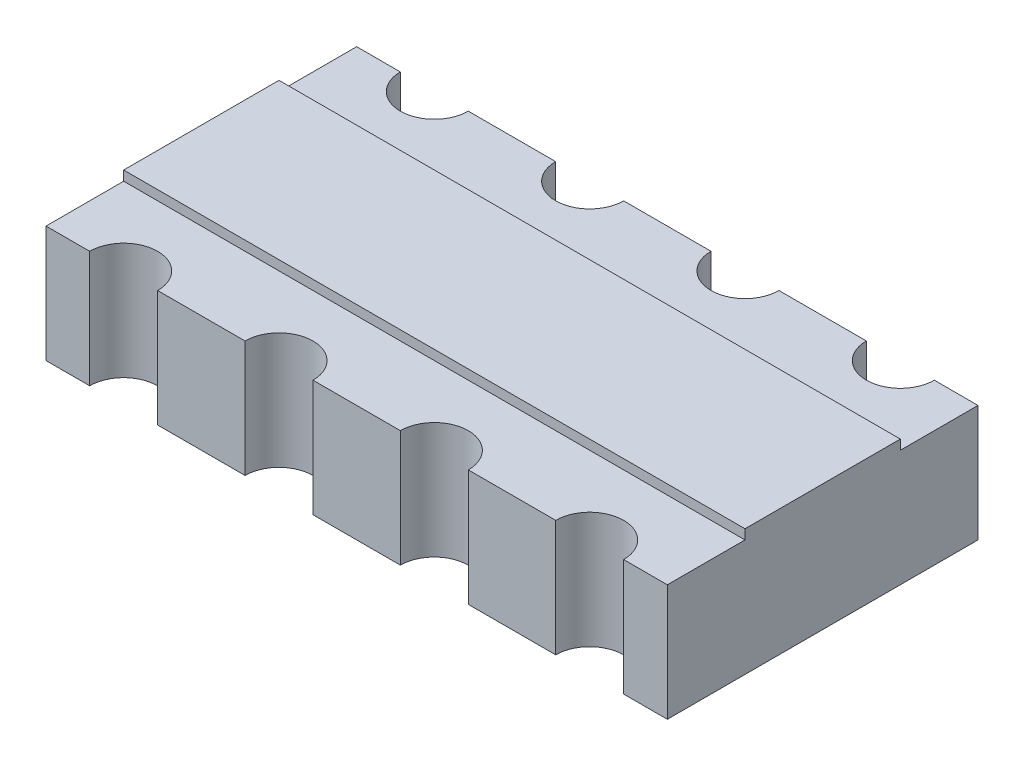
ISO-10303-21;
HEADER;
FILE_DESCRIPTION(('STEP AP214'),'2;1');
FILE_NAME('part.step','',(''),(''),'','','');
FILE_SCHEMA(('AUTOMOTIVE_DESIGN { 1 0 10303 214 1 1 1 1 }'));
ENDSEC;
DATA;
#1=APPLICATION_CONTEXT('core data for automotive mechanical design processes');
#2=APPLICATION_PROTOCOL_DEFINITION('international standard','automotive_design',2000,#1);
#3=PRODUCT_CONTEXT('',#1,'mechanical');
#4=PRODUCT('Part','Part','',(#3));
#5=PRODUCT_RELATED_PRODUCT_CATEGORY('part','',(#4));
#6=PRODUCT_DEFINITION_FORMATION('','',#4);
#7=PRODUCT_DEFINITION_CONTEXT('part definition',#1,'design');
#8=PRODUCT_DEFINITION('design','',#6,#7);
#9=PRODUCT_DEFINITION_SHAPE('','',#8);
#10=(LENGTH_UNIT() NAMED_UNIT(*) SI_UNIT(.MILLI.,.METRE.));
#11=(NAMED_UNIT(*) PLANE_ANGLE_UNIT() SI_UNIT($,.RADIAN.));
#12=(NAMED_UNIT(*) SI_UNIT($,.STERADIAN.) SOLID_ANGLE_UNIT());
#13=UNCERTAINTY_MEASURE_WITH_UNIT(LENGTH_MEASURE(1.E-05),#10,'distance_accuracy_value','');
#14=(GEOMETRIC_REPRESENTATION_CONTEXT(3) GLOBAL_UNCERTAINTY_ASSIGNED_CONTEXT((#13)) GLOBAL_UNIT_ASSIGNED_CONTEXT((#10,
#11,#12)) REPRESENTATION_CONTEXT('',''));
#15=CARTESIAN_POINT('',(0.,0.,0.));
#16=DIRECTION('',(0.,0.,1.));
#17=DIRECTION('',(1.,0.,0.));
#18=AXIS2_PLACEMENT_3D('',#15,#16,#17);
#19=CARTESIAN_POINT('',(0.,0.65,0.));
#20=DIRECTION('',(0.,-1.,0.));
#21=DIRECTION('',(0.,0.,-1.));
#22=AXIS2_PLACEMENT_3D('',#19,#20,#21);
#23=PLANE('',#22);
#24=DIRECTION('',(0.,0.,-1.));
#25=VECTOR('',#24,1.);
#26=CARTESIAN_POINT('',(1.6,0.65,0.4));
#27=LINE('',#26,#25);
#28=CARTESIAN_POINT('',(1.6,0.65,0.4));
#29=VERTEX_POINT('',#28);
#30=CARTESIAN_POINT('',(1.6,0.65,-0.4));
#31=VERTEX_POINT('',#30);
#32=EDGE_CURVE('E264',#29,#31,#27,.T.);
#33=ORIENTED_EDGE('',*,*,#32,.T.);
#34=DIRECTION('',(-1.,0.,0.));
#35=VECTOR('',#34,1.);
#36=CARTESIAN_POINT('',(-1.6,0.65,-0.4));
#37=LINE('',#36,#35);
#38=CARTESIAN_POINT('',(-1.6,0.65,-0.4));
#39=VERTEX_POINT('',#38);
#40=EDGE_CURVE('E29',#31,#39,#37,.T.);
#41=ORIENTED_EDGE('',*,*,#40,.T.);
#42=DIRECTION('',(0.,0.,1.));
#43=VECTOR('',#42,1.);
#44=CARTESIAN_POINT('',(-1.6,0.65,0.4));
#45=LINE('',#44,#43);
#46=CARTESIAN_POINT('',(-1.6,0.65,0.4));
#47=VERTEX_POINT('',#46);
#48=EDGE_CURVE('E239',#39,#47,#45,.T.);
#49=ORIENTED_EDGE('',*,*,#48,.T.);
#50=DIRECTION('',(1.,0.,0.));
#51=VECTOR('',#50,1.);
#52=CARTESIAN_POINT('',(-1.6,0.65,0.4));
#53=LINE('',#52,#51);
#54=EDGE_CURVE('E11',#47,#29,#53,.T.);
#55=ORIENTED_EDGE('',*,*,#54,.T.);
#56=EDGE_LOOP('',(#33,#41,#49,#55));
#57=FACE_BOUND('',#56,.T.);
#58=ADVANCED_FACE('F18',(#57),#23,.F.);
#59=CARTESIAN_POINT('',(-1.6,0.65,0.4));
#60=DIRECTION('',(0.,0.,-1.));
#61=DIRECTION('',(0.,-1.,0.));
#62=AXIS2_PLACEMENT_3D('',#59,#60,#61);
#63=PLANE('',#62);
#64=DIRECTION('',(1.,0.,0.));
#65=VECTOR('',#64,1.);
#66=CARTESIAN_POINT('',(-1.6,0.6,0.4));
#67=LINE('',#66,#65);
#68=CARTESIAN_POINT('',(-1.6,0.6,0.4));
#69=VERTEX_POINT('',#68);
#70=CARTESIAN_POINT('',(1.6,0.6,0.4));
#71=VERTEX_POINT('',#70);
#72=EDGE_CURVE('E213',#69,#71,#67,.T.);
#73=ORIENTED_EDGE('',*,*,#72,.T.);
#74=DIRECTION('',(0.,-1.,0.));
#75=VECTOR('',#74,1.);
#76=CARTESIAN_POINT('',(1.6,0.65,0.4));
#77=LINE('',#76,#75);
#78=EDGE_CURVE('E266',#29,#71,#77,.T.);
#79=ORIENTED_EDGE('',*,*,#78,.F.);
#80=ORIENTED_EDGE('',*,*,#54,.F.);
#81=DIRECTION('',(0.,-1.,0.));
#82=VECTOR('',#81,1.);
#83=CARTESIAN_POINT('',(-1.6,0.65,0.4));
#84=LINE('',#83,#82);
#85=EDGE_CURVE('E323',#47,#69,#84,.T.);
#86=ORIENTED_EDGE('',*,*,#85,.T.);
#87=EDGE_LOOP('',(#73,#79,#80,#86));
#88=FACE_BOUND('',#87,.T.);
#89=ADVANCED_FACE('F957',(#88),#63,.F.);
#90=CARTESIAN_POINT('',(-1.6,0.65,-0.4));
#91=DIRECTION('',(0.,0.,1.));
#92=DIRECTION('',(1.,0.,0.));
#93=AXIS2_PLACEMENT_3D('',#90,#91,#92);
#94=PLANE('',#93);
#95=DIRECTION('',(-1.,0.,0.));
#96=VECTOR('',#95,1.);
#97=CARTESIAN_POINT('',(-1.6,0.6,-0.4));
#98=LINE('',#97,#96);
#99=CARTESIAN_POINT('',(1.6,0.6,-0.4));
#100=VERTEX_POINT('',#99);
#101=CARTESIAN_POINT('',(-1.6,0.6,-0.4));
#102=VERTEX_POINT('',#101);
#103=EDGE_CURVE('E364',#100,#102,#98,.T.);
#104=ORIENTED_EDGE('',*,*,#103,.T.);
#105=DIRECTION('',(0.,-1.,0.));
#106=VECTOR('',#105,1.);
#107=CARTESIAN_POINT('',(-1.6,0.65,-0.4));
#108=LINE('',#107,#106);
#109=EDGE_CURVE('E234',#39,#102,#108,.T.);
#110=ORIENTED_EDGE('',*,*,#109,.F.);
#111=ORIENTED_EDGE('',*,*,#40,.F.);
#112=DIRECTION('',(0.,-1.,0.));
#113=VECTOR('',#112,1.);
#114=CARTESIAN_POINT('',(1.6,0.65,-0.4));
#115=LINE('',#114,#113);
#116=EDGE_CURVE('E261',#31,#100,#115,.T.);
#117=ORIENTED_EDGE('',*,*,#116,.T.);
#118=EDGE_LOOP('',(#104,#110,#111,#117));
#119=FACE_BOUND('',#118,.T.);
#120=ADVANCED_FACE('F948',(#119),#94,.F.);
#121=CARTESIAN_POINT('',(1.2,0.6,-0.8));
#122=DIRECTION('',(0.,-1.,0.));
#123=DIRECTION('',(0.,0.,-1.));
#124=AXIS2_PLACEMENT_3D('',#121,#122,#123);
#125=CYLINDRICAL_SURFACE('',#124,0.175);
#126=CARTESIAN_POINT('',(1.2,0.,-0.8));
#127=DIRECTION('',(0.,1.,0.));
#128=DIRECTION('',(0.,0.,1.));
#129=AXIS2_PLACEMENT_3D('',#126,#127,#128);
#130=CIRCLE('',#129,0.175);
#131=CARTESIAN_POINT('',(1.025,0.,-0.8));
#132=VERTEX_POINT('',#131);
#133=CARTESIAN_POINT('',(1.375,0.,-0.8));
#134=VERTEX_POINT('',#133);
#135=EDGE_CURVE('E403',#132,#134,#130,.T.);
#136=ORIENTED_EDGE('',*,*,#135,.F.);
#137=DIRECTION('',(0.,-1.,0.));
#138=VECTOR('',#137,1.);
#139=CARTESIAN_POINT('',(1.025,0.6,-0.8));
#140=LINE('',#139,#138);
#141=CARTESIAN_POINT('',(1.025,0.6,-0.8));
#142=VERTEX_POINT('',#141);
#143=EDGE_CURVE('E281',#142,#132,#140,.T.);
#144=ORIENTED_EDGE('',*,*,#143,.F.);
#145=CARTESIAN_POINT('',(1.2,0.6,-0.8));
#146=DIRECTION('',(0.,1.,0.));
#147=DIRECTION('',(0.,0.,1.));
#148=AXIS2_PLACEMENT_3D('',#145,#146,#147);
#149=CIRCLE('',#148,0.175);
#150=CARTESIAN_POINT('',(1.375,0.6,-0.8));
#151=VERTEX_POINT('',#150);
#152=EDGE_CURVE('E375',#142,#151,#149,.T.);
#153=ORIENTED_EDGE('',*,*,#152,.T.);
#154=DIRECTION('',(0.,-1.,0.));
#155=VECTOR('',#154,1.);
#156=CARTESIAN_POINT('',(1.375,0.6,-0.8));
#157=LINE('',#156,#155);
#158=EDGE_CURVE('E233',#151,#134,#157,.T.);
#159=ORIENTED_EDGE('',*,*,#158,.T.);
#160=EDGE_LOOP('',(#136,#144,#153,#159));
#161=FACE_BOUND('',#160,.T.);
#162=ADVANCED_FACE('F585',(#161),#125,.F.);
#163=CARTESIAN_POINT('',(0.8,0.6,-0.8));
#164=DIRECTION('',(0.,0.,-1.));
#165=DIRECTION('',(0.,-1.,0.));
#166=AXIS2_PLACEMENT_3D('',#163,#164,#165);
#167=PLANE('',#166);
#168=DIRECTION('',(1.,0.,0.));
#169=VECTOR('',#168,1.);
#170=CARTESIAN_POINT('',(0.8,0.,-0.8));
#171=LINE('',#170,#169);
#172=CARTESIAN_POINT('',(1.6,0.,-0.8));
#173=VERTEX_POINT('',#172);
#174=EDGE_CURVE('E407',#134,#173,#171,.T.);
#175=ORIENTED_EDGE('',*,*,#174,.F.);
#176=ORIENTED_EDGE('',*,*,#158,.F.);
#177=DIRECTION('',(1.,0.,0.));
#178=VECTOR('',#177,1.);
#179=CARTESIAN_POINT('',(0.8,0.6,-0.8));
#180=LINE('',#179,#178);
#181=CARTESIAN_POINT('',(1.6,0.6,-0.8));
#182=VERTEX_POINT('',#181);
#183=EDGE_CURVE('E363',#151,#182,#180,.T.);
#184=ORIENTED_EDGE('',*,*,#183,.T.);
#185=DIRECTION('',(0.,-1.,0.));
#186=VECTOR('',#185,1.);
#187=CARTESIAN_POINT('',(1.6,0.6,-0.8));
#188=LINE('',#187,#186);
#189=EDGE_CURVE('E265',#182,#173,#188,.T.);
#190=ORIENTED_EDGE('',*,*,#189,.T.);
#191=EDGE_LOOP('',(#175,#176,#184,#190));
#192=FACE_BOUND('',#191,.T.);
#193=ADVANCED_FACE('F589',(#192),#167,.T.);
#194=CARTESIAN_POINT('',(1.6,0.6,0.));
#195=DIRECTION('',(1.,0.,0.));
#196=DIRECTION('',(0.,0.,-1.));
#197=AXIS2_PLACEMENT_3D('',#194,#195,#196);
#198=PLANE('',#197);
#199=DIRECTION('',(0.,0.,1.));
#200=VECTOR('',#199,1.);
#201=CARTESIAN_POINT('',(1.6,0.,0.));
#202=LINE('',#201,#200);
#203=CARTESIAN_POINT('',(1.6,0.,0.8));
#204=VERTEX_POINT('',#203);
#205=EDGE_CURVE('E217',#173,#204,#202,.T.);
#206=ORIENTED_EDGE('',*,*,#205,.F.);
#207=ORIENTED_EDGE('',*,*,#189,.F.);
#208=DIRECTION('',(0.,0.,1.));
#209=VECTOR('',#208,1.);
#210=CARTESIAN_POINT('',(1.6,0.6,0.));
#211=LINE('',#210,#209);
#212=EDGE_CURVE('E360',#182,#100,#211,.T.);
#213=ORIENTED_EDGE('',*,*,#212,.T.);
#214=ORIENTED_EDGE('',*,*,#116,.F.);
#215=ORIENTED_EDGE('',*,*,#32,.F.);
#216=ORIENTED_EDGE('',*,*,#78,.T.);
#217=DIRECTION('',(0.,0.,1.));
#218=VECTOR('',#217,1.);
#219=CARTESIAN_POINT('',(1.6,0.6,0.));
#220=LINE('',#219,#218);
#221=CARTESIAN_POINT('',(1.6,0.6,0.8));
#222=VERTEX_POINT('',#221);
#223=EDGE_CURVE('E389',#71,#222,#220,.T.);
#224=ORIENTED_EDGE('',*,*,#223,.T.);
#225=DIRECTION('',(0.,-1.,0.));
#226=VECTOR('',#225,1.);
#227=CARTESIAN_POINT('',(1.6,0.6,0.8));
#228=LINE('',#227,#226);
#229=EDGE_CURVE('E308',#222,#204,#228,.T.);
#230=ORIENTED_EDGE('',*,*,#229,.T.);
#231=EDGE_LOOP('',(#206,#207,#213,#214,#215,#216,#224,#230));
#232=FACE_BOUND('',#231,.T.);
#233=ADVANCED_FACE('F923',(#232),#198,.T.);
#234=CARTESIAN_POINT('',(0.8,0.6,0.8));
#235=DIRECTION('',(0.,0.,-1.));
#236=DIRECTION('',(0.,-1.,0.));
#237=AXIS2_PLACEMENT_3D('',#234,#235,#236);
#238=PLANE('',#237);
#239=DIRECTION('',(1.,0.,0.));
#240=VECTOR('',#239,1.);
#241=CARTESIAN_POINT('',(0.8,0.,0.8));
#242=LINE('',#241,#240);
#243=CARTESIAN_POINT('',(1.375,0.,0.8));
#244=VERTEX_POINT('',#243);
#245=EDGE_CURVE('E246',#244,#204,#242,.T.);
#246=ORIENTED_EDGE('',*,*,#245,.T.);
#247=ORIENTED_EDGE('',*,*,#229,.F.);
#248=DIRECTION('',(1.,0.,0.));
#249=VECTOR('',#248,1.);
#250=CARTESIAN_POINT('',(0.8,0.6,0.8));
#251=LINE('',#250,#249);
#252=CARTESIAN_POINT('',(1.375,0.6,0.8));
#253=VERTEX_POINT('',#252);
#254=EDGE_CURVE('E244',#253,#222,#251,.T.);
#255=ORIENTED_EDGE('',*,*,#254,.F.);
#256=DIRECTION('',(0.,-1.,0.));
#257=VECTOR('',#256,1.);
#258=CARTESIAN_POINT('',(1.375,0.6,0.8));
#259=LINE('',#258,#257);
#260=EDGE_CURVE('E305',#253,#244,#259,.T.);
#261=ORIENTED_EDGE('',*,*,#260,.T.);
#262=EDGE_LOOP('',(#246,#247,#255,#261));
#263=FACE_BOUND('',#262,.T.);
#264=ADVANCED_FACE('F519',(#263),#238,.F.);
#265=CARTESIAN_POINT('',(1.2,0.6,0.8));
#266=DIRECTION('',(0.,-1.,0.));
#267=DIRECTION('',(0.,0.,-1.));
#268=AXIS2_PLACEMENT_3D('',#265,#266,#267);
#269=CYLINDRICAL_SURFACE('',#268,0.175);
#270=CARTESIAN_POINT('',(1.2,0.,0.8));
#271=DIRECTION('',(0.,-1.,0.));
#272=DIRECTION('',(0.,0.,1.));
#273=AXIS2_PLACEMENT_3D('',#270,#271,#272);
#274=CIRCLE('',#273,0.175);
#275=CARTESIAN_POINT('',(1.025,0.,0.8));
#276=VERTEX_POINT('',#275);
#277=EDGE_CURVE('E250',#276,#244,#274,.T.);
#278=ORIENTED_EDGE('',*,*,#277,.T.);
#279=ORIENTED_EDGE('',*,*,#260,.F.);
#280=CARTESIAN_POINT('',(1.2,0.6,0.8));
#281=DIRECTION('',(0.,-1.,0.));
#282=DIRECTION('',(0.,0.,1.));
#283=AXIS2_PLACEMENT_3D('',#280,#281,#282);
#284=CIRCLE('',#283,0.175);
#285=CARTESIAN_POINT('',(1.025,0.6,0.8));
#286=VERTEX_POINT('',#285);
#287=EDGE_CURVE('E240',#286,#253,#284,.T.);
#288=ORIENTED_EDGE('',*,*,#287,.F.);
#289=DIRECTION('',(0.,-1.,0.));
#290=VECTOR('',#289,1.);
#291=CARTESIAN_POINT('',(1.025,0.6,0.8));
#292=LINE('',#291,#290);
#293=EDGE_CURVE('E309',#286,#276,#292,.T.);
#294=ORIENTED_EDGE('',*,*,#293,.T.);
#295=EDGE_LOOP('',(#278,#279,#288,#294));
#296=FACE_BOUND('',#295,.T.);
#297=ADVANCED_FACE('F515',(#296),#269,.F.);
#298=CARTESIAN_POINT('',(0.8,0.6,0.8));
#299=DIRECTION('',(0.,0.,-1.));
#300=DIRECTION('',(0.,-1.,0.));
#301=AXIS2_PLACEMENT_3D('',#298,#299,#300);
#302=PLANE('',#301);
#303=DIRECTION('',(1.,0.,0.));
#304=VECTOR('',#303,1.);
#305=CARTESIAN_POINT('',(0.8,0.,0.8));
#306=LINE('',#305,#304);
#307=CARTESIAN_POINT('',(0.575,0.,0.8));
#308=VERTEX_POINT('',#307);
#309=EDGE_CURVE('E260',#308,#276,#306,.T.);
#310=ORIENTED_EDGE('',*,*,#309,.T.);
#311=ORIENTED_EDGE('',*,*,#293,.F.);
#312=DIRECTION('',(1.,0.,0.));
#313=VECTOR('',#312,1.);
#314=CARTESIAN_POINT('',(0.8,0.6,0.8));
#315=LINE('',#314,#313);
#316=CARTESIAN_POINT('',(0.575,0.6,0.8));
#317=VERTEX_POINT('',#316);
#318=EDGE_CURVE('E245',#317,#286,#315,.T.);
#319=ORIENTED_EDGE('',*,*,#318,.F.);
#320=DIRECTION('',(0.,-1.,0.));
#321=VECTOR('',#320,1.);
#322=CARTESIAN_POINT('',(0.575,0.6,0.8));
#323=LINE('',#322,#321);
#324=EDGE_CURVE('E22',#317,#308,#323,.T.);
#325=ORIENTED_EDGE('',*,*,#324,.T.);
#326=EDGE_LOOP('',(#310,#311,#319,#325));
#327=FACE_BOUND('',#326,.T.);
#328=ADVANCED_FACE('F509',(#327),#302,.F.);
#329=CARTESIAN_POINT('',(0.4,0.6,0.8));
#330=DIRECTION('',(0.,-1.,0.));
#331=DIRECTION('',(0.,0.,-1.));
#332=AXIS2_PLACEMENT_3D('',#329,#330,#331);
#333=CYLINDRICAL_SURFACE('',#332,0.175);
#334=CARTESIAN_POINT('',(0.4,0.,0.8));
#335=DIRECTION('',(0.,1.,0.));
#336=DIRECTION('',(0.,0.,1.));
#337=AXIS2_PLACEMENT_3D('',#334,#335,#336);
#338=CIRCLE('',#337,0.175);
#339=CARTESIAN_POINT('',(0.225,0.,0.8));
#340=VERTEX_POINT('',#339);
#341=EDGE_CURVE('E338',#308,#340,#338,.T.);
#342=ORIENTED_EDGE('',*,*,#341,.F.);
#343=ORIENTED_EDGE('',*,*,#324,.F.);
#344=CARTESIAN_POINT('',(0.4,0.6,0.8));
#345=DIRECTION('',(0.,1.,0.));
#346=DIRECTION('',(0.,0.,1.));
#347=AXIS2_PLACEMENT_3D('',#344,#345,#346);
#348=CIRCLE('',#347,0.175);
#349=CARTESIAN_POINT('',(0.225,0.6,0.8));
#350=VERTEX_POINT('',#349);
#351=EDGE_CURVE('E327',#317,#350,#348,.T.);
#352=ORIENTED_EDGE('',*,*,#351,.T.);
#353=DIRECTION('',(0.,-1.,0.));
#354=VECTOR('',#353,1.);
#355=CARTESIAN_POINT('',(0.225,0.6,0.8));
#356=LINE('',#355,#354);
#357=EDGE_CURVE('E313',#350,#340,#356,.T.);
#358=ORIENTED_EDGE('',*,*,#357,.T.);
#359=EDGE_LOOP('',(#342,#343,#352,#358));
#360=FACE_BOUND('',#359,.T.);
#361=ADVANCED_FACE('F504',(#360),#333,.F.);
#362=CARTESIAN_POINT('',(0.4,0.6,-0.8));
#363=DIRECTION('',(0.,-1.,0.));
#364=DIRECTION('',(0.,0.,-1.));
#365=AXIS2_PLACEMENT_3D('',#362,#363,#364);
#366=CYLINDRICAL_SURFACE('',#365,0.175);
#367=CARTESIAN_POINT('',(0.4,0.,-0.8));
#368=DIRECTION('',(0.,-1.,0.));
#369=DIRECTION('',(0.,0.,1.));
#370=AXIS2_PLACEMENT_3D('',#367,#368,#369);
#371=CIRCLE('',#370,0.175);
#372=CARTESIAN_POINT('',(0.575,0.,-0.8));
#373=VERTEX_POINT('',#372);
#374=CARTESIAN_POINT('',(0.225,0.,-0.8));
#375=VERTEX_POINT('',#374);
#376=EDGE_CURVE('E255',#373,#375,#371,.T.);
#377=ORIENTED_EDGE('',*,*,#376,.T.);
#378=DIRECTION('',(0.,-1.,0.));
#379=VECTOR('',#378,1.);
#380=CARTESIAN_POINT('',(0.225,0.6,-0.8));
#381=LINE('',#380,#379);
#382=CARTESIAN_POINT('',(0.225,0.6,-0.8));
#383=VERTEX_POINT('',#382);
#384=EDGE_CURVE('E219',#383,#375,#381,.T.);
#385=ORIENTED_EDGE('',*,*,#384,.F.);
#386=CARTESIAN_POINT('',(0.4,0.6,-0.8));
#387=DIRECTION('',(0.,-1.,0.));
#388=DIRECTION('',(0.,0.,1.));
#389=AXIS2_PLACEMENT_3D('',#386,#387,#388);
#390=CIRCLE('',#389,0.175);
#391=CARTESIAN_POINT('',(0.575,0.6,-0.8));
#392=VERTEX_POINT('',#391);
#393=EDGE_CURVE('E251',#392,#383,#390,.T.);
#394=ORIENTED_EDGE('',*,*,#393,.F.);
#395=DIRECTION('',(0.,-1.,0.));
#396=VECTOR('',#395,1.);
#397=CARTESIAN_POINT('',(0.575,0.6,-0.8));
#398=LINE('',#397,#396);
#399=EDGE_CURVE('E285',#392,#373,#398,.T.);
#400=ORIENTED_EDGE('',*,*,#399,.T.);
#401=EDGE_LOOP('',(#377,#385,#394,#400));
#402=FACE_BOUND('',#401,.T.);
#403=ADVANCED_FACE('F570',(#402),#366,.F.);
#404=CARTESIAN_POINT('',(0.8,0.6,-0.8));
#405=DIRECTION('',(0.,0.,-1.));
#406=DIRECTION('',(0.,-1.,0.));
#407=AXIS2_PLACEMENT_3D('',#404,#405,#406);
#408=PLANE('',#407);
#409=DIRECTION('',(1.,0.,0.));
#410=VECTOR('',#409,1.);
#411=CARTESIAN_POINT('',(0.8,0.,-0.8));
#412=LINE('',#411,#410);
#413=EDGE_CURVE('E358',#373,#132,#412,.T.);
#414=ORIENTED_EDGE('',*,*,#413,.F.);
#415=ORIENTED_EDGE('',*,*,#399,.F.);
#416=DIRECTION('',(1.,0.,0.));
#417=VECTOR('',#416,1.);
#418=CARTESIAN_POINT('',(0.8,0.6,-0.8));
#419=LINE('',#418,#417);
#420=EDGE_CURVE('E256',#392,#142,#419,.T.);
#421=ORIENTED_EDGE('',*,*,#420,.T.);
#422=ORIENTED_EDGE('',*,*,#143,.T.);
#423=EDGE_LOOP('',(#414,#415,#421,#422));
#424=FACE_BOUND('',#423,.T.);
#425=ADVANCED_FACE('F582',(#424),#408,.T.);
#426=CARTESIAN_POINT('',(-0.8,0.,0.));
#427=DIRECTION('',(0.,1.,0.));
#428=DIRECTION('',(1.,0.,0.));
#429=AXIS2_PLACEMENT_3D('',#426,#427,#428);
#430=PLANE('',#429);
#431=DIRECTION('',(1.,0.,0.));
#432=VECTOR('',#431,1.);
#433=CARTESIAN_POINT('',(-0.8,0.,-0.8));
#434=LINE('',#433,#432);
#435=CARTESIAN_POINT('',(-1.025,0.,-0.8));
#436=VERTEX_POINT('',#435);
#437=CARTESIAN_POINT('',(-0.575,0.,-0.8));
#438=VERTEX_POINT('',#437);
#439=EDGE_CURVE('E408',#436,#438,#434,.T.);
#440=ORIENTED_EDGE('',*,*,#439,.T.);
#441=CARTESIAN_POINT('',(-0.4,0.,-0.8));
#442=DIRECTION('',(0.,1.,0.));
#443=DIRECTION('',(0.,0.,1.));
#444=AXIS2_PLACEMENT_3D('',#441,#442,#443);
#445=CIRCLE('',#444,0.175);
#446=CARTESIAN_POINT('',(-0.225,0.,-0.8));
#447=VERTEX_POINT('',#446);
#448=EDGE_CURVE('E223',#438,#447,#445,.T.);
#449=ORIENTED_EDGE('',*,*,#448,.T.);
#450=DIRECTION('',(1.,0.,0.));
#451=VECTOR('',#450,1.);
#452=CARTESIAN_POINT('',(-0.8,0.,-0.8));
#453=LINE('',#452,#451);
#454=EDGE_CURVE('E290',#447,#375,#453,.T.);
#455=ORIENTED_EDGE('',*,*,#454,.T.);
#456=ORIENTED_EDGE('',*,*,#376,.F.);
#457=ORIENTED_EDGE('',*,*,#413,.T.);
#458=ORIENTED_EDGE('',*,*,#135,.T.);
#459=ORIENTED_EDGE('',*,*,#174,.T.);
#460=ORIENTED_EDGE('',*,*,#205,.T.);
#461=ORIENTED_EDGE('',*,*,#245,.F.);
#462=ORIENTED_EDGE('',*,*,#277,.F.);
#463=ORIENTED_EDGE('',*,*,#309,.F.);
#464=ORIENTED_EDGE('',*,*,#341,.T.);
#465=DIRECTION('',(1.,0.,0.));
#466=VECTOR('',#465,1.);
#467=CARTESIAN_POINT('',(-0.8,0.,0.8));
#468=LINE('',#467,#466);
#469=CARTESIAN_POINT('',(-0.225,0.,0.8));
#470=VERTEX_POINT('',#469);
#471=EDGE_CURVE('E304',#470,#340,#468,.T.);
#472=ORIENTED_EDGE('',*,*,#471,.F.);
#473=CARTESIAN_POINT('',(-0.4,0.,0.8));
#474=DIRECTION('',(0.,-1.,0.));
#475=DIRECTION('',(0.,0.,1.));
#476=AXIS2_PLACEMENT_3D('',#473,#474,#475);
#477=CIRCLE('',#476,0.175);
#478=CARTESIAN_POINT('',(-0.575,0.,0.8));
#479=VERTEX_POINT('',#478);
#480=EDGE_CURVE('E273',#479,#470,#477,.T.);
#481=ORIENTED_EDGE('',*,*,#480,.F.);
#482=DIRECTION('',(1.,0.,0.));
#483=VECTOR('',#482,1.);
#484=CARTESIAN_POINT('',(-0.8,0.,0.8));
#485=LINE('',#484,#483);
#486=CARTESIAN_POINT('',(-1.025,0.,0.8));
#487=VERTEX_POINT('',#486);
#488=EDGE_CURVE('E274',#487,#479,#485,.T.);
#489=ORIENTED_EDGE('',*,*,#488,.F.);
#490=CARTESIAN_POINT('',(-1.2,0.,0.8));
#491=DIRECTION('',(0.,1.,0.));
#492=DIRECTION('',(0.,0.,1.));
#493=AXIS2_PLACEMENT_3D('',#490,#491,#492);
#494=CIRCLE('',#493,0.175);
#495=CARTESIAN_POINT('',(-1.375,0.,0.8));
#496=VERTEX_POINT('',#495);
#497=EDGE_CURVE('E190',#487,#496,#494,.T.);
#498=ORIENTED_EDGE('',*,*,#497,.T.);
#499=DIRECTION('',(1.,0.,0.));
#500=VECTOR('',#499,1.);
#501=CARTESIAN_POINT('',(-0.8,0.,0.8));
#502=LINE('',#501,#500);
#503=CARTESIAN_POINT('',(-1.6,0.,0.8));
#504=VERTEX_POINT('',#503);
#505=EDGE_CURVE('E186',#504,#496,#502,.T.);
#506=ORIENTED_EDGE('',*,*,#505,.F.);
#507=DIRECTION('',(0.,0.,1.));
#508=VECTOR('',#507,1.);
#509=CARTESIAN_POINT('',(-1.6,0.,0.));
#510=LINE('',#509,#508);
#511=CARTESIAN_POINT('',(-1.6,0.,-0.8));
#512=VERTEX_POINT('',#511);
#513=EDGE_CURVE('E279',#512,#504,#510,.T.);
#514=ORIENTED_EDGE('',*,*,#513,.F.);
#515=DIRECTION('',(1.,0.,0.));
#516=VECTOR('',#515,1.);
#517=CARTESIAN_POINT('',(-0.8,0.,-0.8));
#518=LINE('',#517,#516);
#519=CARTESIAN_POINT('',(-1.375,0.,-0.8));
#520=VERTEX_POINT('',#519);
#521=EDGE_CURVE('E298',#512,#520,#518,.T.);
#522=ORIENTED_EDGE('',*,*,#521,.T.);
#523=CARTESIAN_POINT('',(-1.2,0.,-0.8));
#524=DIRECTION('',(0.,-1.,0.));
#525=DIRECTION('',(0.,0.,1.));
#526=AXIS2_PLACEMENT_3D('',#523,#524,#525);
#527=CIRCLE('',#526,0.175);
#528=EDGE_CURVE('E337',#436,#520,#527,.T.);
#529=ORIENTED_EDGE('',*,*,#528,.F.);
#530=EDGE_LOOP('',(#440,#449,#455,#456,#457,#458,#459,#460,#461,#462,#463,#464,#472,#481,#489,
#498,#506,#514,#522,#529));
#531=FACE_BOUND('',#530,.T.);
#532=ADVANCED_FACE('F462',(#531),#430,.F.);
#533=CARTESIAN_POINT('',(-0.8,0.6,0.));
#534=DIRECTION('',(0.,1.,0.));
#535=DIRECTION('',(1.,0.,0.));
#536=AXIS2_PLACEMENT_3D('',#533,#534,#535);
#537=PLANE('',#536);
#538=ORIENTED_EDGE('',*,*,#103,.F.);
#539=ORIENTED_EDGE('',*,*,#212,.F.);
#540=ORIENTED_EDGE('',*,*,#183,.F.);
#541=ORIENTED_EDGE('',*,*,#152,.F.);
#542=ORIENTED_EDGE('',*,*,#420,.F.);
#543=ORIENTED_EDGE('',*,*,#393,.T.);
#544=DIRECTION('',(1.,0.,0.));
#545=VECTOR('',#544,1.);
#546=CARTESIAN_POINT('',(-0.8,0.6,-0.8));
#547=LINE('',#546,#545);
#548=CARTESIAN_POINT('',(-0.225,0.6,-0.8));
#549=VERTEX_POINT('',#548);
#550=EDGE_CURVE('E224',#549,#383,#547,.T.);
#551=ORIENTED_EDGE('',*,*,#550,.F.);
#552=CARTESIAN_POINT('',(-0.4,0.6,-0.8));
#553=DIRECTION('',(0.,1.,0.));
#554=DIRECTION('',(0.,0.,1.));
#555=AXIS2_PLACEMENT_3D('',#552,#553,#554);
#556=CIRCLE('',#555,0.175);
#557=CARTESIAN_POINT('',(-0.575,0.6,-0.8));
#558=VERTEX_POINT('',#557);
#559=EDGE_CURVE('E377',#558,#549,#556,.T.);
#560=ORIENTED_EDGE('',*,*,#559,.F.);
#561=DIRECTION('',(1.,0.,0.));
#562=VECTOR('',#561,1.);
#563=CARTESIAN_POINT('',(-0.8,0.6,-0.8));
#564=LINE('',#563,#562);
#565=CARTESIAN_POINT('',(-1.025,0.6,-0.8));
#566=VERTEX_POINT('',#565);
#567=EDGE_CURVE('E225',#566,#558,#564,.T.);
#568=ORIENTED_EDGE('',*,*,#567,.F.);
#569=CARTESIAN_POINT('',(-1.2,0.6,-0.8));
#570=DIRECTION('',(0.,-1.,0.));
#571=DIRECTION('',(0.,0.,1.));
#572=AXIS2_PLACEMENT_3D('',#569,#570,#571);
#573=CIRCLE('',#572,0.175);
#574=CARTESIAN_POINT('',(-1.375,0.6,-0.8));
#575=VERTEX_POINT('',#574);
#576=EDGE_CURVE('E295',#566,#575,#573,.T.);
#577=ORIENTED_EDGE('',*,*,#576,.T.);
#578=DIRECTION('',(1.,0.,0.));
#579=VECTOR('',#578,1.);
#580=CARTESIAN_POINT('',(-0.8,0.6,-0.8));
#581=LINE('',#580,#579);
#582=CARTESIAN_POINT('',(-1.6,0.6,-0.8));
#583=VERTEX_POINT('',#582);
#584=EDGE_CURVE('E275',#583,#575,#581,.T.);
#585=ORIENTED_EDGE('',*,*,#584,.F.);
#586=DIRECTION('',(0.,0.,1.));
#587=VECTOR('',#586,1.);
#588=CARTESIAN_POINT('',(-1.6,0.6,0.));
#589=LINE('',#588,#587);
#590=EDGE_CURVE('E238',#583,#102,#589,.T.);
#591=ORIENTED_EDGE('',*,*,#590,.T.);
#592=EDGE_LOOP('',(#538,#539,#540,#541,#542,#543,#551,#560,#568,#577,#585,#591));
#593=FACE_BOUND('',#592,.T.);
#594=ADVANCED_FACE('F557',(#593),#537,.T.);
#595=CARTESIAN_POINT('',(-0.4,0.6,-0.8));
#596=DIRECTION('',(0.,-1.,0.));
#597=DIRECTION('',(0.,0.,-1.));
#598=AXIS2_PLACEMENT_3D('',#595,#596,#597);
#599=CYLINDRICAL_SURFACE('',#598,0.175);
#600=ORIENTED_EDGE('',*,*,#448,.F.);
#601=DIRECTION('',(0.,-1.,0.));
#602=VECTOR('',#601,1.);
#603=CARTESIAN_POINT('',(-0.575,0.6,-0.8));
#604=LINE('',#603,#602);
#605=EDGE_CURVE('E229',#558,#438,#604,.T.);
#606=ORIENTED_EDGE('',*,*,#605,.F.);
#607=ORIENTED_EDGE('',*,*,#559,.T.);
#608=DIRECTION('',(0.,-1.,0.));
#609=VECTOR('',#608,1.);
#610=CARTESIAN_POINT('',(-0.225,0.6,-0.8));
#611=LINE('',#610,#609);
#612=EDGE_CURVE('E286',#549,#447,#611,.T.);
#613=ORIENTED_EDGE('',*,*,#612,.T.);
#614=EDGE_LOOP('',(#600,#606,#607,#613));
#615=FACE_BOUND('',#614,.T.);
#616=ADVANCED_FACE('F563',(#615),#599,.F.);
#617=CARTESIAN_POINT('',(-0.8,0.6,-0.8));
#618=DIRECTION('',(0.,0.,-1.));
#619=DIRECTION('',(0.,-1.,0.));
#620=AXIS2_PLACEMENT_3D('',#617,#618,#619);
#621=PLANE('',#620);
#622=ORIENTED_EDGE('',*,*,#454,.F.);
#623=ORIENTED_EDGE('',*,*,#612,.F.);
#624=ORIENTED_EDGE('',*,*,#550,.T.);
#625=ORIENTED_EDGE('',*,*,#384,.T.);
#626=EDGE_LOOP('',(#622,#623,#624,#625));
#627=FACE_BOUND('',#626,.T.);
#628=ADVANCED_FACE('F566',(#627),#621,.T.);
#629=CARTESIAN_POINT('',(-0.8,0.6,0.8));
#630=DIRECTION('',(0.,0.,-1.));
#631=DIRECTION('',(0.,-1.,0.));
#632=AXIS2_PLACEMENT_3D('',#629,#630,#631);
#633=PLANE('',#632);
#634=ORIENTED_EDGE('',*,*,#471,.T.);
#635=ORIENTED_EDGE('',*,*,#357,.F.);
#636=DIRECTION('',(1.,0.,0.));
#637=VECTOR('',#636,1.);
#638=CARTESIAN_POINT('',(-0.8,0.6,0.8));
#639=LINE('',#638,#637);
#640=CARTESIAN_POINT('',(-0.225,0.6,0.8));
#641=VERTEX_POINT('',#640);
#642=EDGE_CURVE('E331',#641,#350,#639,.T.);
#643=ORIENTED_EDGE('',*,*,#642,.F.);
#644=DIRECTION('',(0.,-1.,0.));
#645=VECTOR('',#644,1.);
#646=CARTESIAN_POINT('',(-0.225,0.6,0.8));
#647=LINE('',#646,#645);
#648=EDGE_CURVE('E294',#641,#470,#647,.T.);
#649=ORIENTED_EDGE('',*,*,#648,.T.);
#650=EDGE_LOOP('',(#634,#635,#643,#649));
#651=FACE_BOUND('',#650,.T.);
#652=ADVANCED_FACE('F443',(#651),#633,.F.);
#653=CARTESIAN_POINT('',(-0.4,0.6,0.8));
#654=DIRECTION('',(0.,-1.,0.));
#655=DIRECTION('',(0.,0.,-1.));
#656=AXIS2_PLACEMENT_3D('',#653,#654,#655);
#657=CYLINDRICAL_SURFACE('',#656,0.175);
#658=ORIENTED_EDGE('',*,*,#480,.T.);
#659=ORIENTED_EDGE('',*,*,#648,.F.);
#660=CARTESIAN_POINT('',(-0.4,0.6,0.8));
#661=DIRECTION('',(0.,-1.,0.));
#662=DIRECTION('',(0.,0.,1.));
#663=AXIS2_PLACEMENT_3D('',#660,#661,#662);
#664=CIRCLE('',#663,0.175);
#665=CARTESIAN_POINT('',(-0.575,0.6,0.8));
#666=VERTEX_POINT('',#665);
#667=EDGE_CURVE('E417',#666,#641,#664,.T.);
#668=ORIENTED_EDGE('',*,*,#667,.F.);
#669=DIRECTION('',(0.,-1.,0.));
#670=VECTOR('',#669,1.);
#671=CARTESIAN_POINT('',(-0.575,0.6,0.8));
#672=LINE('',#671,#670);
#673=EDGE_CURVE('E269',#666,#479,#672,.T.);
#674=ORIENTED_EDGE('',*,*,#673,.T.);
#675=EDGE_LOOP('',(#658,#659,#668,#674));
#676=FACE_BOUND('',#675,.T.);
#677=ADVANCED_FACE('F438',(#676),#657,.F.);
#678=CARTESIAN_POINT('',(-0.8,0.6,0.8));
#679=DIRECTION('',(0.,0.,-1.));
#680=DIRECTION('',(0.,-1.,0.));
#681=AXIS2_PLACEMENT_3D('',#678,#679,#680);
#682=PLANE('',#681);
#683=ORIENTED_EDGE('',*,*,#488,.T.);
#684=ORIENTED_EDGE('',*,*,#673,.F.);
#685=DIRECTION('',(1.,0.,0.));
#686=VECTOR('',#685,1.);
#687=CARTESIAN_POINT('',(-0.8,0.6,0.8));
#688=LINE('',#687,#686);
#689=CARTESIAN_POINT('',(-1.025,0.6,0.8));
#690=VERTEX_POINT('',#689);
#691=EDGE_CURVE('E201',#690,#666,#688,.T.);
#692=ORIENTED_EDGE('',*,*,#691,.F.);
#693=DIRECTION('',(0.,-1.,0.));
#694=VECTOR('',#693,1.);
#695=CARTESIAN_POINT('',(-1.025,0.6,0.8));
#696=LINE('',#695,#694);
#697=EDGE_CURVE('E196',#690,#487,#696,.T.);
#698=ORIENTED_EDGE('',*,*,#697,.T.);
#699=EDGE_LOOP('',(#683,#684,#692,#698));
#700=FACE_BOUND('',#699,.T.);
#701=ADVANCED_FACE('F435',(#700),#682,.F.);
#702=CARTESIAN_POINT('',(-1.2,0.6,0.8));
#703=DIRECTION('',(0.,-1.,0.));
#704=DIRECTION('',(0.,0.,-1.));
#705=AXIS2_PLACEMENT_3D('',#702,#703,#704);
#706=CYLINDRICAL_SURFACE('',#705,0.175);
#707=ORIENTED_EDGE('',*,*,#497,.F.);
#708=ORIENTED_EDGE('',*,*,#697,.F.);
#709=CARTESIAN_POINT('',(-1.2,0.6,0.8));
#710=DIRECTION('',(0.,1.,0.));
#711=DIRECTION('',(0.,0.,1.));
#712=AXIS2_PLACEMENT_3D('',#709,#710,#711);
#713=CIRCLE('',#712,0.175);
#714=CARTESIAN_POINT('',(-1.375,0.6,0.8));
#715=VERTEX_POINT('',#714);
#716=EDGE_CURVE('E193',#690,#715,#713,.T.);
#717=ORIENTED_EDGE('',*,*,#716,.T.);
#718=DIRECTION('',(0.,-1.,0.));
#719=VECTOR('',#718,1.);
#720=CARTESIAN_POINT('',(-1.375,0.6,0.8));
#721=LINE('',#720,#719);
#722=EDGE_CURVE('E178',#715,#496,#721,.T.);
#723=ORIENTED_EDGE('',*,*,#722,.T.);
#724=EDGE_LOOP('',(#707,#708,#717,#723));
#725=FACE_BOUND('',#724,.T.);
#726=ADVANCED_FACE('F194',(#725),#706,.F.);
#727=CARTESIAN_POINT('',(-0.8,0.6,0.8));
#728=DIRECTION('',(0.,0.,-1.));
#729=DIRECTION('',(0.,-1.,0.));
#730=AXIS2_PLACEMENT_3D('',#727,#728,#729);
#731=PLANE('',#730);
#732=ORIENTED_EDGE('',*,*,#505,.T.);
#733=ORIENTED_EDGE('',*,*,#722,.F.);
#734=DIRECTION('',(1.,0.,0.));
#735=VECTOR('',#734,1.);
#736=CARTESIAN_POINT('',(-0.8,0.6,0.8));
#737=LINE('',#736,#735);
#738=CARTESIAN_POINT('',(-1.6,0.6,0.8));
#739=VERTEX_POINT('',#738);
#740=EDGE_CURVE('E183',#739,#715,#737,.T.);
#741=ORIENTED_EDGE('',*,*,#740,.F.);
#742=DIRECTION('',(0.,-1.,0.));
#743=VECTOR('',#742,1.);
#744=CARTESIAN_POINT('',(-1.6,0.6,0.8));
#745=LINE('',#744,#743);
#746=EDGE_CURVE('E320',#739,#504,#745,.T.);
#747=ORIENTED_EDGE('',*,*,#746,.T.);
#748=EDGE_LOOP('',(#732,#733,#741,#747));
#749=FACE_BOUND('',#748,.T.);
#750=ADVANCED_FACE('F180',(#749),#731,.F.);
#751=CARTESIAN_POINT('',(-1.6,0.6,0.));
#752=DIRECTION('',(1.,0.,0.));
#753=DIRECTION('',(0.,0.,-1.));
#754=AXIS2_PLACEMENT_3D('',#751,#752,#753);
#755=PLANE('',#754);
#756=ORIENTED_EDGE('',*,*,#513,.T.);
#757=ORIENTED_EDGE('',*,*,#746,.F.);
#758=DIRECTION('',(0.,0.,1.));
#759=VECTOR('',#758,1.);
#760=CARTESIAN_POINT('',(-1.6,0.6,0.));
#761=LINE('',#760,#759);
#762=EDGE_CURVE('E206',#69,#739,#761,.T.);
#763=ORIENTED_EDGE('',*,*,#762,.F.);
#764=ORIENTED_EDGE('',*,*,#85,.F.);
#765=ORIENTED_EDGE('',*,*,#48,.F.);
#766=ORIENTED_EDGE('',*,*,#109,.T.);
#767=ORIENTED_EDGE('',*,*,#590,.F.);
#768=DIRECTION('',(0.,-1.,0.));
#769=VECTOR('',#768,1.);
#770=CARTESIAN_POINT('',(-1.6,0.6,-0.8));
#771=LINE('',#770,#769);
#772=EDGE_CURVE('E280',#583,#512,#771,.T.);
#773=ORIENTED_EDGE('',*,*,#772,.T.);
#774=EDGE_LOOP('',(#756,#757,#763,#764,#765,#766,#767,#773));
#775=FACE_BOUND('',#774,.T.);
#776=ADVANCED_FACE('F552',(#775),#755,.F.);
#777=CARTESIAN_POINT('',(-0.8,0.6,-0.8));
#778=DIRECTION('',(0.,0.,-1.));
#779=DIRECTION('',(0.,-1.,0.));
#780=AXIS2_PLACEMENT_3D('',#777,#778,#779);
#781=PLANE('',#780);
#782=ORIENTED_EDGE('',*,*,#521,.F.);
#783=ORIENTED_EDGE('',*,*,#772,.F.);
#784=ORIENTED_EDGE('',*,*,#584,.T.);
#785=DIRECTION('',(0.,-1.,0.));
#786=VECTOR('',#785,1.);
#787=CARTESIAN_POINT('',(-1.375,0.6,-0.8));
#788=LINE('',#787,#786);
#789=EDGE_CURVE('E299',#575,#520,#788,.T.);
#790=ORIENTED_EDGE('',*,*,#789,.T.);
#791=EDGE_LOOP('',(#782,#783,#784,#790));
#792=FACE_BOUND('',#791,.T.);
#793=ADVANCED_FACE('F20',(#792),#781,.T.);
#794=CARTESIAN_POINT('',(-1.2,0.6,-0.8));
#795=DIRECTION('',(0.,-1.,0.));
#796=DIRECTION('',(0.,0.,-1.));
#797=AXIS2_PLACEMENT_3D('',#794,#795,#796);
#798=CYLINDRICAL_SURFACE('',#797,0.175);
#799=ORIENTED_EDGE('',*,*,#528,.T.);
#800=ORIENTED_EDGE('',*,*,#789,.F.);
#801=ORIENTED_EDGE('',*,*,#576,.F.);
#802=DIRECTION('',(0.,-1.,0.));
#803=VECTOR('',#802,1.);
#804=CARTESIAN_POINT('',(-1.025,0.6,-0.8));
#805=LINE('',#804,#803);
#806=EDGE_CURVE('E230',#566,#436,#805,.T.);
#807=ORIENTED_EDGE('',*,*,#806,.T.);
#808=EDGE_LOOP('',(#799,#800,#801,#807));
#809=FACE_BOUND('',#808,.T.);
#810=ADVANCED_FACE('F459',(#809),#798,.F.);
#811=CARTESIAN_POINT('',(-0.8,0.6,-0.8));
#812=DIRECTION('',(0.,0.,-1.));
#813=DIRECTION('',(0.,-1.,0.));
#814=AXIS2_PLACEMENT_3D('',#811,#812,#813);
#815=PLANE('',#814);
#816=ORIENTED_EDGE('',*,*,#439,.F.);
#817=ORIENTED_EDGE('',*,*,#806,.F.);
#818=ORIENTED_EDGE('',*,*,#567,.T.);
#819=ORIENTED_EDGE('',*,*,#605,.T.);
#820=EDGE_LOOP('',(#816,#817,#818,#819));
#821=FACE_BOUND('',#820,.T.);
#822=ADVANCED_FACE('F561',(#821),#815,.T.);
#823=CARTESIAN_POINT('',(-0.8,0.6,0.));
#824=DIRECTION('',(0.,1.,0.));
#825=DIRECTION('',(1.,0.,0.));
#826=AXIS2_PLACEMENT_3D('',#823,#824,#825);
#827=PLANE('',#826);
#828=ORIENTED_EDGE('',*,*,#72,.F.);
#829=ORIENTED_EDGE('',*,*,#762,.T.);
#830=ORIENTED_EDGE('',*,*,#740,.T.);
#831=ORIENTED_EDGE('',*,*,#716,.F.);
#832=ORIENTED_EDGE('',*,*,#691,.T.);
#833=ORIENTED_EDGE('',*,*,#667,.T.);
#834=ORIENTED_EDGE('',*,*,#642,.T.);
#835=ORIENTED_EDGE('',*,*,#351,.F.);
#836=ORIENTED_EDGE('',*,*,#318,.T.);
#837=ORIENTED_EDGE('',*,*,#287,.T.);
#838=ORIENTED_EDGE('',*,*,#254,.T.);
#839=ORIENTED_EDGE('',*,*,#223,.F.);
#840=EDGE_LOOP('',(#828,#829,#830,#831,#832,#833,#834,#835,#836,#837,#838,#839));
#841=FACE_BOUND('',#840,.T.);
#842=ADVANCED_FACE('F204',(#841),#827,.T.);
#843=CLOSED_SHELL('',(#58,#89,#120,#162,#193,#233,#264,#297,#328,#361,#403,#425,#532,#594,#616,
#628,#652,#677,#701,#726,#750,#776,#793,#810,#822,#842));
#844=MANIFOLD_SOLID_BREP('B1',#843);
#845=ADVANCED_BREP_SHAPE_REPRESENTATION('',(#18,#844),#14);
#846=SHAPE_DEFINITION_REPRESENTATION(#9,#845);
ENDSEC;
END-ISO-10303-21;
